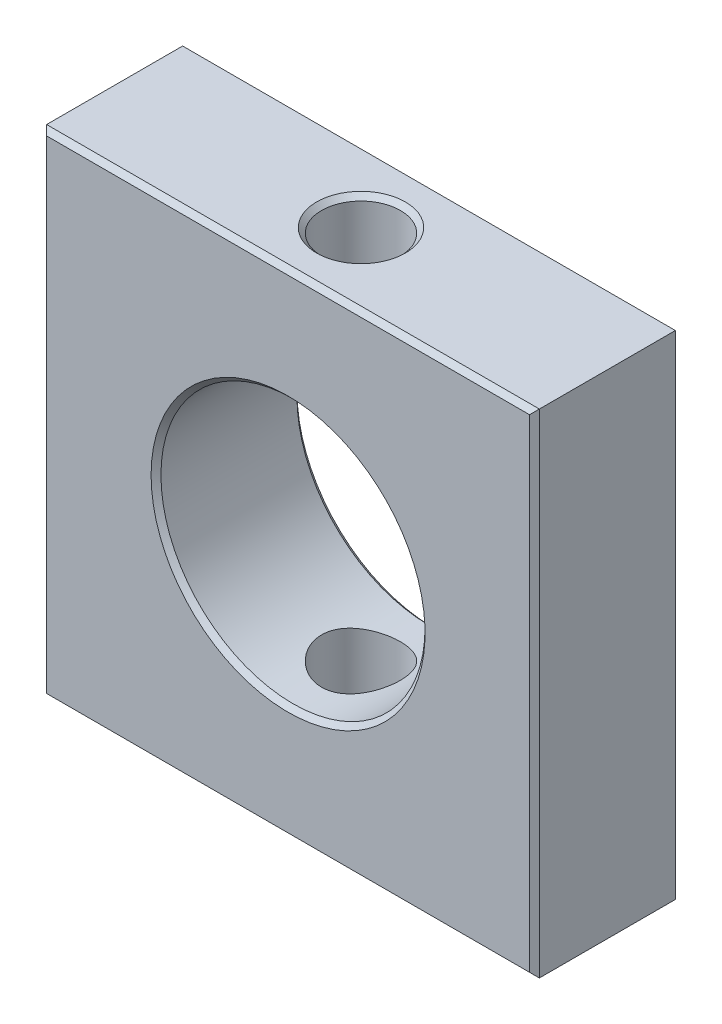
ISO-10303-21;
HEADER;
FILE_DESCRIPTION(('STEP AP214'),'2;1');
FILE_NAME('part.step','',(''),(''),'','','');
FILE_SCHEMA(('AUTOMOTIVE_DESIGN { 1 0 10303 214 1 1 1 1 }'));
ENDSEC;
DATA;
#1=APPLICATION_CONTEXT('core data for automotive mechanical design processes');
#2=APPLICATION_PROTOCOL_DEFINITION('international standard','automotive_design',2000,#1);
#3=PRODUCT_CONTEXT('',#1,'mechanical');
#4=PRODUCT('Part','Part','',(#3));
#5=PRODUCT_RELATED_PRODUCT_CATEGORY('part','',(#4));
#6=PRODUCT_DEFINITION_FORMATION('','',#4);
#7=PRODUCT_DEFINITION_CONTEXT('part definition',#1,'design');
#8=PRODUCT_DEFINITION('design','',#6,#7);
#9=PRODUCT_DEFINITION_SHAPE('','',#8);
#10=(LENGTH_UNIT() NAMED_UNIT(*) SI_UNIT(.MILLI.,.METRE.));
#11=(NAMED_UNIT(*) PLANE_ANGLE_UNIT() SI_UNIT($,.RADIAN.));
#12=(NAMED_UNIT(*) SI_UNIT($,.STERADIAN.) SOLID_ANGLE_UNIT());
#13=UNCERTAINTY_MEASURE_WITH_UNIT(LENGTH_MEASURE(1.E-05),#10,'distance_accuracy_value','');
#14=(GEOMETRIC_REPRESENTATION_CONTEXT(3) GLOBAL_UNCERTAINTY_ASSIGNED_CONTEXT((#13)) GLOBAL_UNIT_ASSIGNED_CONTEXT((#10,
#11,#12)) REPRESENTATION_CONTEXT('',''));
#15=CARTESIAN_POINT('',(0.,0.,0.));
#16=DIRECTION('',(0.,0.,1.));
#17=DIRECTION('',(1.,0.,0.));
#18=AXIS2_PLACEMENT_3D('',#15,#16,#17);
#19=CARTESIAN_POINT('',(0.,0.,7.4));
#20=DIRECTION('',(0.,0.,-1.));
#21=DIRECTION('',(-1.,0.,0.));
#22=AXIS2_PLACEMENT_3D('',#19,#20,#21);
#23=PLANE('',#22);
#24=CARTESIAN_POINT('',(0.,0.,7.4));
#25=DIRECTION('',(0.,0.,-1.));
#26=DIRECTION('',(-1.,0.,0.));
#27=AXIS2_PLACEMENT_3D('',#24,#25,#26);
#28=CIRCLE('',#27,6.94999999999999);
#29=CARTESIAN_POINT('',(-6.94999999999999,0.,7.4));
#30=VERTEX_POINT('',#29);
#31=EDGE_CURVE('E199',#30,#30,#28,.T.);
#32=ORIENTED_EDGE('',*,*,#31,.T.);
#33=EDGE_LOOP('',(#32));
#34=FACE_BOUND('',#33,.T.);
#35=DIRECTION('',(0.,-1.,0.));
#36=VECTOR('',#35,1.);
#37=CARTESIAN_POINT('',(-12.25,0.,7.4));
#38=LINE('',#37,#36);
#39=CARTESIAN_POINT('',(-12.25,12.25,7.4));
#40=VERTEX_POINT('',#39);
#41=CARTESIAN_POINT('',(-12.25,-12.25,7.4));
#42=VERTEX_POINT('',#41);
#43=EDGE_CURVE('E60',#40,#42,#38,.T.);
#44=ORIENTED_EDGE('',*,*,#43,.T.);
#45=DIRECTION('',(1.,0.,0.));
#46=VECTOR('',#45,1.);
#47=CARTESIAN_POINT('',(0.,-12.25,7.4));
#48=LINE('',#47,#46);
#49=CARTESIAN_POINT('',(12.25,-12.25,7.4));
#50=VERTEX_POINT('',#49);
#51=EDGE_CURVE('E196',#42,#50,#48,.T.);
#52=ORIENTED_EDGE('',*,*,#51,.T.);
#53=DIRECTION('',(0.,1.,0.));
#54=VECTOR('',#53,1.);
#55=CARTESIAN_POINT('',(12.25,0.,7.4));
#56=LINE('',#55,#54);
#57=CARTESIAN_POINT('',(12.25,12.25,7.4));
#58=VERTEX_POINT('',#57);
#59=EDGE_CURVE('E189',#50,#58,#56,.T.);
#60=ORIENTED_EDGE('',*,*,#59,.T.);
#61=DIRECTION('',(-1.,0.,0.));
#62=VECTOR('',#61,1.);
#63=CARTESIAN_POINT('',(0.,12.25,7.4));
#64=LINE('',#63,#62);
#65=EDGE_CURVE('E65',#58,#40,#64,.T.);
#66=ORIENTED_EDGE('',*,*,#65,.T.);
#67=EDGE_LOOP('',(#44,#52,#60,#66));
#68=FACE_BOUND('',#67,.T.);
#69=ADVANCED_FACE('F41',(#34,#68),#23,.F.);
#70=CARTESIAN_POINT('',(0.,0.,0.));
#71=DIRECTION('',(0.,0.,-1.));
#72=DIRECTION('',(-1.,0.,0.));
#73=AXIS2_PLACEMENT_3D('',#70,#71,#72);
#74=PLANE('',#73);
#75=CARTESIAN_POINT('',(0.,0.,0.));
#76=DIRECTION('',(0.,0.,-1.));
#77=DIRECTION('',(-1.,0.,0.));
#78=AXIS2_PLACEMENT_3D('',#75,#76,#77);
#79=CIRCLE('',#78,6.95);
#80=CARTESIAN_POINT('',(-6.95,0.,0.));
#81=VERTEX_POINT('',#80);
#82=EDGE_CURVE('E140',#81,#81,#79,.F.);
#83=ORIENTED_EDGE('',*,*,#82,.T.);
#84=EDGE_LOOP('',(#83));
#85=FACE_BOUND('',#84,.T.);
#86=DIRECTION('',(0.,1.,0.));
#87=VECTOR('',#86,1.);
#88=CARTESIAN_POINT('',(-12.25,12.5,0.));
#89=LINE('',#88,#87);
#90=CARTESIAN_POINT('',(-12.25,-12.25,0.));
#91=VERTEX_POINT('',#90);
#92=CARTESIAN_POINT('',(-12.25,12.25,0.));
#93=VERTEX_POINT('',#92);
#94=EDGE_CURVE('E138',#91,#93,#89,.T.);
#95=ORIENTED_EDGE('',*,*,#94,.T.);
#96=DIRECTION('',(1.,0.,0.));
#97=VECTOR('',#96,1.);
#98=CARTESIAN_POINT('',(12.5,12.25,0.));
#99=LINE('',#98,#97);
#100=CARTESIAN_POINT('',(12.25,12.25,0.));
#101=VERTEX_POINT('',#100);
#102=EDGE_CURVE('E115',#93,#101,#99,.T.);
#103=ORIENTED_EDGE('',*,*,#102,.T.);
#104=DIRECTION('',(0.,-1.,0.));
#105=VECTOR('',#104,1.);
#106=CARTESIAN_POINT('',(12.25,-12.5,0.));
#107=LINE('',#106,#105);
#108=CARTESIAN_POINT('',(12.25,-12.25,0.));
#109=VERTEX_POINT('',#108);
#110=EDGE_CURVE('E126',#101,#109,#107,.T.);
#111=ORIENTED_EDGE('',*,*,#110,.T.);
#112=DIRECTION('',(-1.,0.,0.));
#113=VECTOR('',#112,1.);
#114=CARTESIAN_POINT('',(-12.5,-12.25,0.));
#115=LINE('',#114,#113);
#116=EDGE_CURVE('E133',#109,#91,#115,.T.);
#117=ORIENTED_EDGE('',*,*,#116,.T.);
#118=EDGE_LOOP('',(#95,#103,#111,#117));
#119=FACE_BOUND('',#118,.T.);
#120=ADVANCED_FACE('F136',(#85,#119),#74,.T.);
#121=CARTESIAN_POINT('',(12.5,-12.5,7.4));
#122=DIRECTION('',(-1.,0.,0.));
#123=DIRECTION('',(0.,0.,1.));
#124=AXIS2_PLACEMENT_3D('',#121,#122,#123);
#125=PLANE('',#124);
#126=DIRECTION('',(0.,0.,-1.));
#127=VECTOR('',#126,1.);
#128=CARTESIAN_POINT('',(12.5,-12.5,7.4));
#129=LINE('',#128,#127);
#130=CARTESIAN_POINT('',(12.5,-12.5,7.15));
#131=VERTEX_POINT('',#130);
#132=CARTESIAN_POINT('',(12.5,-12.5,0.25));
#133=VERTEX_POINT('',#132);
#134=EDGE_CURVE('E380',#131,#133,#129,.T.);
#135=ORIENTED_EDGE('',*,*,#134,.T.);
#136=DIRECTION('',(0.,1.,0.));
#137=VECTOR('',#136,1.);
#138=CARTESIAN_POINT('',(12.5,12.5,0.25));
#139=LINE('',#138,#137);
#140=CARTESIAN_POINT('',(12.5,12.5,0.25));
#141=VERTEX_POINT('',#140);
#142=EDGE_CURVE('E186',#133,#141,#139,.T.);
#143=ORIENTED_EDGE('',*,*,#142,.T.);
#144=DIRECTION('',(0.,0.,-1.));
#145=VECTOR('',#144,1.);
#146=CARTESIAN_POINT('',(12.5,12.5,7.4));
#147=LINE('',#146,#145);
#148=CARTESIAN_POINT('',(12.5,12.5,7.15));
#149=VERTEX_POINT('',#148);
#150=EDGE_CURVE('E134',#149,#141,#147,.T.);
#151=ORIENTED_EDGE('',*,*,#150,.F.);
#152=DIRECTION('',(0.,-1.,0.));
#153=VECTOR('',#152,1.);
#154=CARTESIAN_POINT('',(12.5,-12.5,7.15));
#155=LINE('',#154,#153);
#156=EDGE_CURVE('E183',#149,#131,#155,.T.);
#157=ORIENTED_EDGE('',*,*,#156,.T.);
#158=EDGE_LOOP('',(#135,#143,#151,#157));
#159=FACE_BOUND('',#158,.T.);
#160=ADVANCED_FACE('F243',(#159),#125,.F.);
#161=CARTESIAN_POINT('',(-12.5,12.5,7.4));
#162=DIRECTION('',(0.,-1.,0.));
#163=DIRECTION('',(0.,0.,-1.));
#164=AXIS2_PLACEMENT_3D('',#161,#162,#163);
#165=PLANE('',#164);
#166=CARTESIAN_POINT('',(0.,12.5,3.7));
#167=DIRECTION('',(0.,-1.,0.));
#168=DIRECTION('',(0.,0.,-1.));
#169=AXIS2_PLACEMENT_3D('',#166,#167,#168);
#170=CIRCLE('',#169,2.25);
#171=CARTESIAN_POINT('',(0.,12.5,1.45));
#172=VERTEX_POINT('',#171);
#173=EDGE_CURVE('E157',#172,#172,#170,.T.);
#174=ORIENTED_EDGE('',*,*,#173,.T.);
#175=EDGE_LOOP('',(#174));
#176=FACE_BOUND('',#175,.T.);
#177=ORIENTED_EDGE('',*,*,#150,.T.);
#178=DIRECTION('',(-1.,0.,0.));
#179=VECTOR('',#178,1.);
#180=CARTESIAN_POINT('',(-12.5,12.5,0.25));
#181=LINE('',#180,#179);
#182=CARTESIAN_POINT('',(-12.5,12.5,0.25));
#183=VERTEX_POINT('',#182);
#184=EDGE_CURVE('E118',#141,#183,#181,.T.);
#185=ORIENTED_EDGE('',*,*,#184,.T.);
#186=DIRECTION('',(0.,0.,-1.));
#187=VECTOR('',#186,1.);
#188=CARTESIAN_POINT('',(-12.5,12.5,7.4));
#189=LINE('',#188,#187);
#190=CARTESIAN_POINT('',(-12.5,12.5,7.15));
#191=VERTEX_POINT('',#190);
#192=EDGE_CURVE('E240',#191,#183,#189,.T.);
#193=ORIENTED_EDGE('',*,*,#192,.F.);
#194=DIRECTION('',(1.,0.,0.));
#195=VECTOR('',#194,1.);
#196=CARTESIAN_POINT('',(-12.5,12.5,7.15));
#197=LINE('',#196,#195);
#198=EDGE_CURVE('E161',#191,#149,#197,.T.);
#199=ORIENTED_EDGE('',*,*,#198,.T.);
#200=EDGE_LOOP('',(#177,#185,#193,#199));
#201=FACE_BOUND('',#200,.T.);
#202=ADVANCED_FACE('F238',(#176,#201),#165,.F.);
#203=CARTESIAN_POINT('',(-12.5,-12.5,7.4));
#204=DIRECTION('',(1.,0.,0.));
#205=DIRECTION('',(0.,0.,-1.));
#206=AXIS2_PLACEMENT_3D('',#203,#204,#205);
#207=PLANE('',#206);
#208=ORIENTED_EDGE('',*,*,#192,.T.);
#209=DIRECTION('',(0.,-1.,0.));
#210=VECTOR('',#209,1.);
#211=CARTESIAN_POINT('',(-12.5,-12.5,0.25));
#212=LINE('',#211,#210);
#213=CARTESIAN_POINT('',(-12.5,-12.5,0.25));
#214=VERTEX_POINT('',#213);
#215=EDGE_CURVE('E169',#183,#214,#212,.T.);
#216=ORIENTED_EDGE('',*,*,#215,.T.);
#217=DIRECTION('',(0.,0.,-1.));
#218=VECTOR('',#217,1.);
#219=CARTESIAN_POINT('',(-12.5,-12.5,7.4));
#220=LINE('',#219,#218);
#221=CARTESIAN_POINT('',(-12.5,-12.5,7.15));
#222=VERTEX_POINT('',#221);
#223=EDGE_CURVE('E248',#222,#214,#220,.T.);
#224=ORIENTED_EDGE('',*,*,#223,.F.);
#225=DIRECTION('',(0.,1.,0.));
#226=VECTOR('',#225,1.);
#227=CARTESIAN_POINT('',(-12.5,-12.5,7.15));
#228=LINE('',#227,#226);
#229=EDGE_CURVE('E166',#222,#191,#228,.T.);
#230=ORIENTED_EDGE('',*,*,#229,.T.);
#231=EDGE_LOOP('',(#208,#216,#224,#230));
#232=FACE_BOUND('',#231,.T.);
#233=ADVANCED_FACE('F292',(#232),#207,.F.);
#234=CARTESIAN_POINT('',(-12.5,-12.5,7.4));
#235=DIRECTION('',(0.,1.,0.));
#236=DIRECTION('',(0.,0.,1.));
#237=AXIS2_PLACEMENT_3D('',#234,#235,#236);
#238=PLANE('',#237);
#239=CARTESIAN_POINT('',(0.,-12.5,3.7));
#240=DIRECTION('',(0.,1.,0.));
#241=DIRECTION('',(0.,0.,1.));
#242=AXIS2_PLACEMENT_3D('',#239,#240,#241);
#243=CIRCLE('',#242,2.25);
#244=CARTESIAN_POINT('',(0.,-12.5,5.94999999999999));
#245=VERTEX_POINT('',#244);
#246=EDGE_CURVE('E172',#245,#245,#243,.T.);
#247=ORIENTED_EDGE('',*,*,#246,.T.);
#248=EDGE_LOOP('',(#247));
#249=FACE_BOUND('',#248,.T.);
#250=ORIENTED_EDGE('',*,*,#223,.T.);
#251=DIRECTION('',(1.,0.,0.));
#252=VECTOR('',#251,1.);
#253=CARTESIAN_POINT('',(12.5,-12.5,0.25));
#254=LINE('',#253,#252);
#255=EDGE_CURVE('E180',#214,#133,#254,.T.);
#256=ORIENTED_EDGE('',*,*,#255,.T.);
#257=ORIENTED_EDGE('',*,*,#134,.F.);
#258=DIRECTION('',(-1.,0.,0.));
#259=VECTOR('',#258,1.);
#260=CARTESIAN_POINT('',(-12.5,-12.5,7.15));
#261=LINE('',#260,#259);
#262=EDGE_CURVE('E176',#131,#222,#261,.T.);
#263=ORIENTED_EDGE('',*,*,#262,.T.);
#264=EDGE_LOOP('',(#250,#256,#257,#263));
#265=FACE_BOUND('',#264,.T.);
#266=ADVANCED_FACE('F279',(#249,#265),#238,.F.);
#267=CARTESIAN_POINT('',(0.,0.,7.4));
#268=DIRECTION('',(0.,0.,-1.));
#269=DIRECTION('',(-1.,0.,0.));
#270=AXIS2_PLACEMENT_3D('',#267,#268,#269);
#271=CYLINDRICAL_SURFACE('',#270,6.7);
#272=CARTESIAN_POINT('',(0.,0.,0.250000000000002));
#273=DIRECTION('',(0.,0.,-1.));
#274=DIRECTION('',(-1.,0.,0.));
#275=AXIS2_PLACEMENT_3D('',#272,#273,#274);
#276=CIRCLE('',#275,6.7);
#277=CARTESIAN_POINT('',(-6.7,0.,0.250000000000002));
#278=VERTEX_POINT('',#277);
#279=EDGE_CURVE('E153',#278,#278,#276,.T.);
#280=ORIENTED_EDGE('',*,*,#279,.T.);
#281=EDGE_LOOP('',(#280));
#282=FACE_BOUND('',#281,.T.);
#283=CARTESIAN_POINT('',(0.,0.,7.15));
#284=DIRECTION('',(0.,0.,-1.));
#285=DIRECTION('',(-1.,0.,0.));
#286=AXIS2_PLACEMENT_3D('',#283,#284,#285);
#287=CIRCLE('',#286,6.7);
#288=CARTESIAN_POINT('',(-6.7,0.,7.15));
#289=VERTEX_POINT('',#288);
#290=EDGE_CURVE('E145',#289,#289,#287,.F.);
#291=ORIENTED_EDGE('',*,*,#290,.T.);
#292=EDGE_LOOP('',(#291));
#293=FACE_BOUND('',#292,.T.);
#294=CARTESIAN_POINT('',(0.,-6.7,5.7));
#295=CARTESIAN_POINT('',(0.109743361358821,-6.69999901435449,5.69999860184998));
#296=CARTESIAN_POINT('',(0.219500873974359,-6.69727785917086,5.69093733235752));
#297=CARTESIAN_POINT('',(0.435821268100605,-6.68668840274671,5.65501665808003));
#298=CARTESIAN_POINT('',(0.542383159189071,-6.67881852265205,5.62815179379803));
#299=CARTESIAN_POINT('',(0.749160848463717,-6.65879423500564,5.55759966332937));
#300=CARTESIAN_POINT('',(0.849385705061714,-6.64664611410368,5.51393707186632));
#301=CARTESIAN_POINT('',(1.04109165908827,-6.61932898536908,5.41112964199115));
#302=CARTESIAN_POINT('',(1.13257161705671,-6.60415958465563,5.35198278972377));
#303=CARTESIAN_POINT('',(1.30679399162978,-6.57193622855964,5.21811234060998));
#304=CARTESIAN_POINT('',(1.38925243957815,-6.55484394233304,5.14302842818817));
#305=CARTESIAN_POINT('',(1.54061411732459,-6.52093067960535,4.98018327120106));
#306=CARTESIAN_POINT('',(1.60951509351046,-6.50410974863661,4.89241992317427));
#307=CARTESIAN_POINT('',(1.73329508752743,-6.47223883737101,4.70431083280065));
#308=CARTESIAN_POINT('',(1.78782844079823,-6.45723652410896,4.60372880113103));
#309=CARTESIAN_POINT('',(1.87909105818033,-6.43127391741259,4.39430167159646));
#310=CARTESIAN_POINT('',(1.91582454975421,-6.42031266437555,4.28545854284966));
#311=CARTESIAN_POINT('',(1.96942250711186,-6.40407252509908,4.06578563291481));
#312=CARTESIAN_POINT('',(1.98681009654374,-6.39864438114924,3.95509481772434));
#313=CARTESIAN_POINT('',(2.00285608148857,-6.393640941842,3.73224433880319));
#314=CARTESIAN_POINT('',(2.00151896423086,-6.39406424423099,3.62008503342111));
#315=CARTESIAN_POINT('',(1.98056458959883,-6.40058352381707,3.40172718064994));
#316=CARTESIAN_POINT('',(1.96160163408821,-6.40647644804714,3.29545877974806));
#317=CARTESIAN_POINT('',(1.90699057622309,-6.42294264775203,3.08768611210035));
#318=CARTESIAN_POINT('',(1.87134084195745,-6.43351638098884,2.98618231238508));
#319=CARTESIAN_POINT('',(1.78388388495136,-6.45831561688666,2.78921484781267));
#320=CARTESIAN_POINT('',(1.73186365844019,-6.47258879593137,2.69385201932576));
#321=CARTESIAN_POINT('',(1.61329044901396,-6.50315565265741,2.51298952762155));
#322=CARTESIAN_POINT('',(1.54673397423003,-6.51944981540837,2.42749224184044));
#323=CARTESIAN_POINT('',(1.39772347841685,-6.55304722393875,2.26507539922493));
#324=CARTESIAN_POINT('',(1.31472616230933,-6.57036434391284,2.18865631222923));
#325=CARTESIAN_POINT('',(1.13687871372721,-6.60345945676516,2.0507055351464));
#326=CARTESIAN_POINT('',(1.04202785044614,-6.61923735463889,1.98917476365559));
#327=CARTESIAN_POINT('',(0.842262554658351,-6.64761795940622,1.88244739970788));
#328=CARTESIAN_POINT('',(0.73728605348341,-6.66019910688464,1.83736086675264));
#329=CARTESIAN_POINT('',(0.520777756762124,-6.68061329202322,1.76563038239234));
#330=CARTESIAN_POINT('',(0.40924778001447,-6.68844764030789,1.73898133997835));
#331=CARTESIAN_POINT('',(0.187053836849448,-6.69827863557586,1.70571326617071));
#332=CARTESIAN_POINT('',(0.0765000326649953,-6.70047290955619,1.69841585461959));
#333=CARTESIAN_POINT('',(-0.144259260354484,-6.69935577174841,1.70215810056413));
#334=CARTESIAN_POINT('',(-0.254464793255684,-6.69604508692854,1.7131953368414));
#335=CARTESIAN_POINT('',(-0.468845320229736,-6.68441932098258,1.75274463654809));
#336=CARTESIAN_POINT('',(-0.573100014213629,-6.67621759074487,1.78086115128937));
#337=CARTESIAN_POINT('',(-0.775390199297328,-6.65575803734013,1.85329576315047));
#338=CARTESIAN_POINT('',(-0.873424943904828,-6.64349972841274,1.89761580064912));
#339=CARTESIAN_POINT('',(-1.06299504601103,-6.6158472668663,2.00234366564223));
#340=CARTESIAN_POINT('',(-1.15432925198953,-6.6003875200001,2.06309781840749));
#341=CARTESIAN_POINT('',(-1.32573767112902,-6.56810776474197,2.19854782625144));
#342=CARTESIAN_POINT('',(-1.40580908065082,-6.55128741929277,2.27324714195717));
#343=CARTESIAN_POINT('',(-1.55540014036077,-6.51742513941161,2.43765354745442));
#344=CARTESIAN_POINT('',(-1.62443729290816,-6.50039695797792,2.5278034344722));
#345=CARTESIAN_POINT('',(-1.74643651734004,-6.46868973914826,2.71877840931161));
#346=CARTESIAN_POINT('',(-1.79939902761497,-6.45401063769292,2.81960320590408));
#347=CARTESIAN_POINT('',(-1.88738025081556,-6.42883293312705,3.02873352788058));
#348=CARTESIAN_POINT('',(-1.9224839672241,-6.41831458016538,3.13700077744645));
#349=CARTESIAN_POINT('',(-1.97385869716872,-6.40270385956844,3.35828167105228));
#350=CARTESIAN_POINT('',(-1.99013608322307,-6.39760965596106,3.47129369560412));
#351=CARTESIAN_POINT('',(-2.0029658351958,-6.3936036354854,3.69384728759221));
#352=CARTESIAN_POINT('',(-2.00030418711452,-6.3944454551483,3.80333970611141));
#353=CARTESIAN_POINT('',(-1.97720508955258,-6.40162503364949,4.02024022034185));
#354=CARTESIAN_POINT('',(-1.95676833875767,-6.40796257646741,4.1276483978087));
#355=CARTESIAN_POINT('',(-1.89920426613909,-6.42525509132359,4.33606062800298));
#356=CARTESIAN_POINT('',(-1.86228309951481,-6.4361529294676,4.43712671172225));
#357=CARTESIAN_POINT('',(-1.77295860632938,-6.46132813255444,4.63171053082962));
#358=CARTESIAN_POINT('',(-1.7205523393202,-6.47560613925115,4.72522682829942));
#359=CARTESIAN_POINT('',(-1.59952912057487,-6.50657638983081,4.90570883384898));
#360=CARTESIAN_POINT('',(-1.53039517029805,-6.52333719036361,4.99231609879284));
#361=CARTESIAN_POINT('',(-1.37881207245741,-6.55704939466007,5.15295496626138));
#362=CARTESIAN_POINT('',(-1.29635948205938,-6.5740008466497,5.22698330698632));
#363=CARTESIAN_POINT('',(-1.11761480582216,-6.60677053085957,5.36248971014035));
#364=CARTESIAN_POINT('',(-1.02099212501924,-6.62254197161737,5.42354416925239));
#365=CARTESIAN_POINT('',(-0.81838237942453,-6.65061520610284,5.52845547097434));
#366=CARTESIAN_POINT('',(-0.712399803993862,-6.66291865147025,5.57232050398056));
#367=CARTESIAN_POINT('',(-0.506100419135844,-6.68157083352248,5.6375894330366));
#368=CARTESIAN_POINT('',(-0.406438821554194,-6.68842498929753,5.66093041929964));
#369=CARTESIAN_POINT('',(-0.20452196133352,-6.6976396648136,5.69213509027727));
#370=CARTESIAN_POINT('',(-0.102267125082487,-6.70000091849868,5.70000130290144));
#371=CARTESIAN_POINT('',(0.,-6.7,5.7));
#372=B_SPLINE_CURVE_WITH_KNOTS('',3,(#294,#295,#296,#297,#298,#299,#300,#301,#302,#303,#304,
#305,#306,#307,#308,#309,#310,#311,#312,#313,#314,#315,#316,#317,#318,#319,#320,#321,#322,#323,
#324,#325,#326,#327,#328,#329,#330,#331,#332,#333,#334,#335,#336,#337,#338,#339,#340,#341,#342,
#343,#344,#345,#346,#347,#348,#349,#350,#351,#352,#353,#354,#355,#356,#357,#358,#359,#360,#361,
#362,#363,#364,#365,#366,#367,#368,#369,#370,#371),.UNSPECIFIED.,.T.,.F.,(4,2,2,2,2,2,2,2,2,2,2,
2,2,2,2,2,2,2,2,2,2,2,2,2,2,2,2,2,2,2,2,2,2,2,2,2,2,2,4),(0.,0.32885446291896,0.657809816205378,
0.986283790076346,1.31480050592643,1.65173545532978,1.98872636505149,2.33320675681966,
2.67760529443513,3.01244589828376,3.3472062615768,3.67001573967276,3.99285679405367,
4.32008541956658,4.64739273792106,4.98822575334411,5.32907979251338,5.67217499194088,
6.01517541715933,6.34598232115241,6.6767455432545,7.00012590953024,7.32354501343517,
7.65439703412549,7.98533126834956,8.32815604163266,8.67097146449875,9.01213953466786,
9.35319208914254,9.68017574503415,10.0071465487638,10.3301380400965,10.6531909033726,
10.9879082937643,11.322712346613,11.6671737515337,12.0114708277658,12.3179722441952,
12.6244235873731),.UNSPECIFIED.);
#373=CARTESIAN_POINT('',(0.,-6.7,5.7));
#374=VERTEX_POINT('',#373);
#375=EDGE_CURVE('E260',#374,#374,#372,.T.);
#376=ORIENTED_EDGE('',*,*,#375,.F.);
#377=EDGE_LOOP('',(#376));
#378=FACE_BOUND('',#377,.T.);
#379=CARTESIAN_POINT('',(0.,6.7,5.7));
#380=CARTESIAN_POINT('',(-0.109743361358818,6.69999901435449,5.69999860184998));
#381=CARTESIAN_POINT('',(-0.219500873974355,6.69727785917086,5.69093733235752));
#382=CARTESIAN_POINT('',(-0.435821268100602,6.68668840274672,5.65501665808003));
#383=CARTESIAN_POINT('',(-0.542383159189068,6.67881852265206,5.62815179379803));
#384=CARTESIAN_POINT('',(-0.749160848463714,6.65879423500564,5.55759966332937));
#385=CARTESIAN_POINT('',(-0.84938570506171,6.64664611410368,5.51393707186632));
#386=CARTESIAN_POINT('',(-1.04109165908826,6.61932898536908,5.41112964199115));
#387=CARTESIAN_POINT('',(-1.1325716170567,6.60415958465563,5.35198278972377));
#388=CARTESIAN_POINT('',(-1.30679399162978,6.57193622855964,5.21811234060998));
#389=CARTESIAN_POINT('',(-1.38925243957814,6.55484394233304,5.14302842818817));
#390=CARTESIAN_POINT('',(-1.54061411732458,6.52093067960535,4.98018327120106));
#391=CARTESIAN_POINT('',(-1.60951509351046,6.50410974863661,4.89241992317427));
#392=CARTESIAN_POINT('',(-1.73329508752743,6.47223883737101,4.70431083280065));
#393=CARTESIAN_POINT('',(-1.78782844079822,6.45723652410896,4.60372880113102));
#394=CARTESIAN_POINT('',(-1.87909105818032,6.43127391741259,4.39430167159646));
#395=CARTESIAN_POINT('',(-1.91582454975421,6.42031266437556,4.28545854284966));
#396=CARTESIAN_POINT('',(-1.96942250711185,6.40407252509909,4.0657856329148));
#397=CARTESIAN_POINT('',(-1.98681009654373,6.39864438114925,3.95509481772434));
#398=CARTESIAN_POINT('',(-2.00285608148856,6.393640941842,3.73224433880319));
#399=CARTESIAN_POINT('',(-2.00151896423086,6.39406424423099,3.62008503342111));
#400=CARTESIAN_POINT('',(-1.98056458959882,6.40058352381708,3.40172718064994));
#401=CARTESIAN_POINT('',(-1.9616016340882,6.40647644804714,3.29545877974806));
#402=CARTESIAN_POINT('',(-1.90699057622308,6.42294264775203,3.08768611210035));
#403=CARTESIAN_POINT('',(-1.87134084195745,6.43351638098884,2.98618231238508));
#404=CARTESIAN_POINT('',(-1.78388388495136,6.45831561688666,2.78921484781267));
#405=CARTESIAN_POINT('',(-1.73186365844019,6.47258879593137,2.69385201932576));
#406=CARTESIAN_POINT('',(-1.61329044901396,6.50315565265741,2.51298952762155));
#407=CARTESIAN_POINT('',(-1.54673397423002,6.51944981540838,2.42749224184044));
#408=CARTESIAN_POINT('',(-1.39772347841684,6.55304722393875,2.26507539922493));
#409=CARTESIAN_POINT('',(-1.31472616230933,6.57036434391284,2.18865631222923));
#410=CARTESIAN_POINT('',(-1.13687871372721,6.60345945676517,2.0507055351464));
#411=CARTESIAN_POINT('',(-1.04202785044614,6.61923735463889,1.98917476365559));
#412=CARTESIAN_POINT('',(-0.842262554658348,6.64761795940622,1.88244739970788));
#413=CARTESIAN_POINT('',(-0.737286053483406,6.66019910688464,1.83736086675264));
#414=CARTESIAN_POINT('',(-0.52077775676212,6.68061329202322,1.76563038239234));
#415=CARTESIAN_POINT('',(-0.409247780014466,6.68844764030789,1.73898133997835));
#416=CARTESIAN_POINT('',(-0.187053836849444,6.69827863557586,1.70571326617071));
#417=CARTESIAN_POINT('',(-0.0765000326649912,6.70047290955619,1.69841585461959));
#418=CARTESIAN_POINT('',(0.144259260354488,6.69935577174841,1.70215810056413));
#419=CARTESIAN_POINT('',(0.254464793255688,6.69604508692854,1.7131953368414));
#420=CARTESIAN_POINT('',(0.46884532022974,6.68441932098258,1.75274463654809));
#421=CARTESIAN_POINT('',(0.573100014213633,6.67621759074487,1.78086115128937));
#422=CARTESIAN_POINT('',(0.775390199297332,6.65575803734013,1.85329576315047));
#423=CARTESIAN_POINT('',(0.873424943904832,6.64349972841274,1.89761580064912));
#424=CARTESIAN_POINT('',(1.06299504601103,6.6158472668663,2.00234366564223));
#425=CARTESIAN_POINT('',(1.15432925198954,6.6003875200001,2.06309781840749));
#426=CARTESIAN_POINT('',(1.32573767112903,6.56810776474197,2.19854782625144));
#427=CARTESIAN_POINT('',(1.40580908065083,6.55128741929277,2.27324714195717));
#428=CARTESIAN_POINT('',(1.55540014036078,6.51742513941161,2.43765354745442));
#429=CARTESIAN_POINT('',(1.62443729290817,6.50039695797792,2.5278034344722));
#430=CARTESIAN_POINT('',(1.74643651734005,6.46868973914826,2.71877840931161));
#431=CARTESIAN_POINT('',(1.79939902761497,6.45401063769292,2.81960320590408));
#432=CARTESIAN_POINT('',(1.88738025081556,6.42883293312705,3.02873352788058));
#433=CARTESIAN_POINT('',(1.9224839672241,6.41831458016538,3.13700077744645));
#434=CARTESIAN_POINT('',(1.97385869716872,6.40270385956844,3.35828167105228));
#435=CARTESIAN_POINT('',(1.99013608322308,6.39760965596106,3.47129369560412));
#436=CARTESIAN_POINT('',(2.0029658351958,6.39360363548539,3.69384728759221));
#437=CARTESIAN_POINT('',(2.00030418711452,6.3944454551483,3.80333970611141));
#438=CARTESIAN_POINT('',(1.97720508955258,6.40162503364949,4.02024022034185));
#439=CARTESIAN_POINT('',(1.95676833875768,6.40796257646741,4.1276483978087));
#440=CARTESIAN_POINT('',(1.89920426613909,6.42525509132359,4.33606062800298));
#441=CARTESIAN_POINT('',(1.86228309951482,6.4361529294676,4.43712671172225));
#442=CARTESIAN_POINT('',(1.77295860632938,6.46132813255444,4.63171053082962));
#443=CARTESIAN_POINT('',(1.7205523393202,6.47560613925115,4.72522682829942));
#444=CARTESIAN_POINT('',(1.59952912057487,6.50657638983081,4.90570883384898));
#445=CARTESIAN_POINT('',(1.53039517029805,6.5233371903636,4.99231609879284));
#446=CARTESIAN_POINT('',(1.37881207245741,6.55704939466007,5.15295496626138));
#447=CARTESIAN_POINT('',(1.29635948205938,6.5740008466497,5.22698330698632));
#448=CARTESIAN_POINT('',(1.11761480582217,6.60677053085957,5.36248971014035));
#449=CARTESIAN_POINT('',(1.02099212501924,6.62254197161737,5.42354416925239));
#450=CARTESIAN_POINT('',(0.818382379424535,6.65061520610284,5.52845547097434));
#451=CARTESIAN_POINT('',(0.712399803993866,6.66291865147025,5.57232050398056));
#452=CARTESIAN_POINT('',(0.506100419135847,6.68157083352248,5.6375894330366));
#453=CARTESIAN_POINT('',(0.406438821554197,6.68842498929753,5.66093041929964));
#454=CARTESIAN_POINT('',(0.204521961333524,6.6976396648136,5.69213509027727));
#455=CARTESIAN_POINT('',(0.10226712508249,6.70000091849868,5.70000130290144));
#456=CARTESIAN_POINT('',(0.,6.7,5.7));
#457=B_SPLINE_CURVE_WITH_KNOTS('',3,(#379,#380,#381,#382,#383,#384,#385,#386,#387,#388,#389,
#390,#391,#392,#393,#394,#395,#396,#397,#398,#399,#400,#401,#402,#403,#404,#405,#406,#407,#408,
#409,#410,#411,#412,#413,#414,#415,#416,#417,#418,#419,#420,#421,#422,#423,#424,#425,#426,#427,
#428,#429,#430,#431,#432,#433,#434,#435,#436,#437,#438,#439,#440,#441,#442,#443,#444,#445,#446,
#447,#448,#449,#450,#451,#452,#453,#454,#455,#456),.UNSPECIFIED.,.T.,.F.,(4,2,2,2,2,2,2,2,2,2,2,
2,2,2,2,2,2,2,2,2,2,2,2,2,2,2,2,2,2,2,2,2,2,2,2,2,2,2,4),(0.,0.32885446291896,0.657809816205378,
0.986283790076346,1.31480050592642,1.65173545532978,1.98872636505149,2.33320675681966,
2.67760529443513,3.01244589828376,3.3472062615768,3.67001573967276,3.99285679405367,
4.32008541956658,4.64739273792106,4.98822575334411,5.32907979251338,5.67217499194088,
6.01517541715933,6.34598232115241,6.6767455432545,7.00012590953024,7.32354501343517,
7.65439703412548,7.98533126834956,8.32815604163266,8.67097146449875,9.01213953466785,
9.35319208914254,9.68017574503415,10.0071465487638,10.3301380400965,10.6531909033726,
10.9879082937643,11.322712346613,11.6671737515337,12.0114708277658,12.3179722441952,
12.6244235873731),.UNSPECIFIED.);
#458=CARTESIAN_POINT('',(0.,6.7,5.7));
#459=VERTEX_POINT('',#458);
#460=EDGE_CURVE('E213',#459,#459,#457,.T.);
#461=ORIENTED_EDGE('',*,*,#460,.F.);
#462=EDGE_LOOP('',(#461));
#463=FACE_BOUND('',#462,.T.);
#464=ADVANCED_FACE('F264',(#282,#293,#378,#463),#271,.F.);
#465=CARTESIAN_POINT('',(0.,-12.5,3.7));
#466=DIRECTION('',(0.,1.,0.));
#467=DIRECTION('',(0.,0.,1.));
#468=AXIS2_PLACEMENT_3D('',#465,#466,#467);
#469=CYLINDRICAL_SURFACE('',#468,2.);
#470=CARTESIAN_POINT('',(0.,12.25,3.7));
#471=DIRECTION('',(0.,-1.,0.));
#472=DIRECTION('',(0.,0.,-1.));
#473=AXIS2_PLACEMENT_3D('',#470,#471,#472);
#474=CIRCLE('',#473,2.);
#475=CARTESIAN_POINT('',(0.,12.25,1.7));
#476=VERTEX_POINT('',#475);
#477=EDGE_CURVE('E11',#476,#476,#474,.F.);
#478=ORIENTED_EDGE('',*,*,#477,.T.);
#479=EDGE_LOOP('',(#478));
#480=FACE_BOUND('',#479,.T.);
#481=ORIENTED_EDGE('',*,*,#460,.T.);
#482=EDGE_LOOP('',(#481));
#483=FACE_BOUND('',#482,.T.);
#484=ADVANCED_FACE('F267',(#480,#483),#469,.F.);
#485=CARTESIAN_POINT('',(0.,-12.25,3.7));
#486=DIRECTION('',(0.,1.,0.));
#487=DIRECTION('',(0.,0.,1.));
#488=AXIS2_PLACEMENT_3D('',#485,#486,#487);
#489=CIRCLE('',#488,2.);
#490=CARTESIAN_POINT('',(0.,-12.25,5.7));
#491=VERTEX_POINT('',#490);
#492=EDGE_CURVE('E52',#491,#491,#489,.F.);
#493=ORIENTED_EDGE('',*,*,#492,.T.);
#494=EDGE_LOOP('',(#493));
#495=FACE_BOUND('',#494,.T.);
#496=ORIENTED_EDGE('',*,*,#375,.T.);
#497=EDGE_LOOP('',(#496));
#498=FACE_BOUND('',#497,.T.);
#499=ADVANCED_FACE('F270',(#495,#498),#469,.F.);
#500=CARTESIAN_POINT('',(0.,0.,0.));
#501=DIRECTION('',(0.,0.,-1.));
#502=DIRECTION('',(-1.,0.,0.));
#503=AXIS2_PLACEMENT_3D('',#500,#501,#502);
#504=CONICAL_SURFACE('',#503,6.95,0.785398163397447);
#505=ORIENTED_EDGE('',*,*,#279,.F.);
#506=EDGE_LOOP('',(#505));
#507=FACE_BOUND('',#506,.T.);
#508=ORIENTED_EDGE('',*,*,#82,.F.);
#509=EDGE_LOOP('',(#508));
#510=FACE_BOUND('',#509,.T.);
#511=ADVANCED_FACE('F277',(#507,#510),#504,.F.);
#512=CARTESIAN_POINT('',(-12.5,-12.5,0.25));
#513=DIRECTION('',(0.,-0.707106781186552,-0.707106781186543));
#514=DIRECTION('',(-1.,0.,0.));
#515=AXIS2_PLACEMENT_3D('',#512,#513,#514);
#516=PLANE('',#515);
#517=DIRECTION('',(0.577350269189623,0.577350269189623,-0.577350269189631));
#518=VECTOR('',#517,1.);
#519=CARTESIAN_POINT('',(-12.5,-12.5,0.25));
#520=LINE('',#519,#518);
#521=EDGE_CURVE('E122',#91,#214,#520,.F.);
#522=ORIENTED_EDGE('',*,*,#521,.F.);
#523=ORIENTED_EDGE('',*,*,#116,.F.);
#524=DIRECTION('',(-0.577350269189623,0.577350269189623,-0.577350269189631));
#525=VECTOR('',#524,1.);
#526=CARTESIAN_POINT('',(12.5,-12.5,0.25));
#527=LINE('',#526,#525);
#528=EDGE_CURVE('E129',#133,#109,#527,.T.);
#529=ORIENTED_EDGE('',*,*,#528,.F.);
#530=ORIENTED_EDGE('',*,*,#255,.F.);
#531=EDGE_LOOP('',(#522,#523,#529,#530));
#532=FACE_BOUND('',#531,.T.);
#533=ADVANCED_FACE('F308',(#532),#516,.T.);
#534=CARTESIAN_POINT('',(12.5,-12.5,0.25));
#535=DIRECTION('',(0.707106781186552,0.,-0.707106781186543));
#536=DIRECTION('',(0.,-1.,0.));
#537=AXIS2_PLACEMENT_3D('',#534,#535,#536);
#538=PLANE('',#537);
#539=ORIENTED_EDGE('',*,*,#528,.T.);
#540=ORIENTED_EDGE('',*,*,#110,.F.);
#541=DIRECTION('',(0.577350269189623,0.577350269189623,0.577350269189631));
#542=VECTOR('',#541,1.);
#543=CARTESIAN_POINT('',(4.16666666666675,4.16666666666675,-8.08333333333337));
#544=LINE('',#543,#542);
#545=EDGE_CURVE('E111',#141,#101,#544,.F.);
#546=ORIENTED_EDGE('',*,*,#545,.F.);
#547=ORIENTED_EDGE('',*,*,#142,.F.);
#548=EDGE_LOOP('',(#539,#540,#546,#547));
#549=FACE_BOUND('',#548,.T.);
#550=ADVANCED_FACE('F127',(#549),#538,.T.);
#551=CARTESIAN_POINT('',(-12.5,-12.5,0.25));
#552=DIRECTION('',(-0.707106781186552,0.,-0.707106781186543));
#553=DIRECTION('',(0.,1.,0.));
#554=AXIS2_PLACEMENT_3D('',#551,#552,#553);
#555=PLANE('',#554);
#556=ORIENTED_EDGE('',*,*,#521,.T.);
#557=ORIENTED_EDGE('',*,*,#215,.F.);
#558=DIRECTION('',(0.577350269189623,-0.577350269189623,-0.577350269189631));
#559=VECTOR('',#558,1.);
#560=CARTESIAN_POINT('',(-4.16666666666674,4.16666666666675,-8.08333333333337));
#561=LINE('',#560,#559);
#562=EDGE_CURVE('E123',#93,#183,#561,.F.);
#563=ORIENTED_EDGE('',*,*,#562,.F.);
#564=ORIENTED_EDGE('',*,*,#94,.F.);
#565=EDGE_LOOP('',(#556,#557,#563,#564));
#566=FACE_BOUND('',#565,.T.);
#567=ADVANCED_FACE('F318',(#566),#555,.T.);
#568=CARTESIAN_POINT('',(-12.5,12.5,0.25));
#569=DIRECTION('',(0.,0.707106781186552,-0.707106781186543));
#570=DIRECTION('',(1.,0.,0.));
#571=AXIS2_PLACEMENT_3D('',#568,#569,#570);
#572=PLANE('',#571);
#573=ORIENTED_EDGE('',*,*,#545,.T.);
#574=ORIENTED_EDGE('',*,*,#102,.F.);
#575=ORIENTED_EDGE('',*,*,#562,.T.);
#576=ORIENTED_EDGE('',*,*,#184,.F.);
#577=EDGE_LOOP('',(#573,#574,#575,#576));
#578=FACE_BOUND('',#577,.T.);
#579=ADVANCED_FACE('F113',(#578),#572,.T.);
#580=CARTESIAN_POINT('',(0.,0.,7.15));
#581=DIRECTION('',(0.,0.,1.));
#582=DIRECTION('',(1.,0.,0.));
#583=AXIS2_PLACEMENT_3D('',#580,#581,#582);
#584=CONICAL_SURFACE('',#583,6.7,0.785398163397443);
#585=ORIENTED_EDGE('',*,*,#31,.F.);
#586=EDGE_LOOP('',(#585));
#587=FACE_BOUND('',#586,.T.);
#588=ORIENTED_EDGE('',*,*,#290,.F.);
#589=EDGE_LOOP('',(#588));
#590=FACE_BOUND('',#589,.T.);
#591=ADVANCED_FACE('F317',(#587,#590),#584,.F.);
#592=CARTESIAN_POINT('',(0.,12.25,7.4));
#593=DIRECTION('',(0.,-0.707106781186547,-0.707106781186547));
#594=DIRECTION('',(-1.,0.,0.));
#595=AXIS2_PLACEMENT_3D('',#592,#593,#594);
#596=PLANE('',#595);
#597=DIRECTION('',(-0.577350269189626,-0.577350269189626,0.577350269189626));
#598=VECTOR('',#597,1.);
#599=CARTESIAN_POINT('',(8.16666666666667,8.16666666666667,11.4833333333333));
#600=LINE('',#599,#598);
#601=EDGE_CURVE('E219',#149,#58,#600,.T.);
#602=ORIENTED_EDGE('',*,*,#601,.F.);
#603=ORIENTED_EDGE('',*,*,#198,.F.);
#604=DIRECTION('',(0.577350269189626,-0.577350269189626,0.577350269189626));
#605=VECTOR('',#604,1.);
#606=CARTESIAN_POINT('',(-8.16666666666666,8.16666666666667,11.4833333333333));
#607=LINE('',#606,#605);
#608=EDGE_CURVE('E46',#40,#191,#607,.F.);
#609=ORIENTED_EDGE('',*,*,#608,.F.);
#610=ORIENTED_EDGE('',*,*,#65,.F.);
#611=EDGE_LOOP('',(#602,#603,#609,#610));
#612=FACE_BOUND('',#611,.T.);
#613=ADVANCED_FACE('F233',(#612),#596,.F.);
#614=CARTESIAN_POINT('',(-12.25,0.,7.4));
#615=DIRECTION('',(0.707106781186547,0.,-0.707106781186547));
#616=DIRECTION('',(0.,-1.,0.));
#617=AXIS2_PLACEMENT_3D('',#614,#615,#616);
#618=PLANE('',#617);
#619=ORIENTED_EDGE('',*,*,#608,.T.);
#620=ORIENTED_EDGE('',*,*,#229,.F.);
#621=DIRECTION('',(0.577350269189626,0.577350269189626,0.577350269189626));
#622=VECTOR('',#621,1.);
#623=CARTESIAN_POINT('',(-8.16666666666666,-8.16666666666667,11.4833333333333));
#624=LINE('',#623,#622);
#625=EDGE_CURVE('E217',#42,#222,#624,.F.);
#626=ORIENTED_EDGE('',*,*,#625,.F.);
#627=ORIENTED_EDGE('',*,*,#43,.F.);
#628=EDGE_LOOP('',(#619,#620,#626,#627));
#629=FACE_BOUND('',#628,.T.);
#630=ADVANCED_FACE('F230',(#629),#618,.F.);
#631=CARTESIAN_POINT('',(12.25,0.,7.4));
#632=DIRECTION('',(-0.707106781186547,0.,-0.707106781186547));
#633=DIRECTION('',(0.,1.,0.));
#634=AXIS2_PLACEMENT_3D('',#631,#632,#633);
#635=PLANE('',#634);
#636=ORIENTED_EDGE('',*,*,#601,.T.);
#637=ORIENTED_EDGE('',*,*,#59,.F.);
#638=DIRECTION('',(0.577350269189626,-0.577350269189626,-0.577350269189626));
#639=VECTOR('',#638,1.);
#640=CARTESIAN_POINT('',(8.16666666666667,-8.16666666666667,11.4833333333333));
#641=LINE('',#640,#639);
#642=EDGE_CURVE('E214',#131,#50,#641,.F.);
#643=ORIENTED_EDGE('',*,*,#642,.F.);
#644=ORIENTED_EDGE('',*,*,#156,.F.);
#645=EDGE_LOOP('',(#636,#637,#643,#644));
#646=FACE_BOUND('',#645,.T.);
#647=ADVANCED_FACE('F349',(#646),#635,.F.);
#648=CARTESIAN_POINT('',(0.,-12.25,7.4));
#649=DIRECTION('',(0.,0.707106781186547,-0.707106781186547));
#650=DIRECTION('',(1.,0.,0.));
#651=AXIS2_PLACEMENT_3D('',#648,#649,#650);
#652=PLANE('',#651);
#653=ORIENTED_EDGE('',*,*,#625,.T.);
#654=ORIENTED_EDGE('',*,*,#262,.F.);
#655=ORIENTED_EDGE('',*,*,#642,.T.);
#656=ORIENTED_EDGE('',*,*,#51,.F.);
#657=EDGE_LOOP('',(#653,#654,#655,#656));
#658=FACE_BOUND('',#657,.T.);
#659=ADVANCED_FACE('F341',(#658),#652,.F.);
#660=CARTESIAN_POINT('',(0.,-12.5,3.7));
#661=DIRECTION('',(0.,-1.,0.));
#662=DIRECTION('',(0.,0.,-1.));
#663=AXIS2_PLACEMENT_3D('',#660,#661,#662);
#664=CONICAL_SURFACE('',#663,2.25,0.785398163397455);
#665=ORIENTED_EDGE('',*,*,#492,.F.);
#666=EDGE_LOOP('',(#665));
#667=FACE_BOUND('',#666,.T.);
#668=ORIENTED_EDGE('',*,*,#246,.F.);
#669=EDGE_LOOP('',(#668));
#670=FACE_BOUND('',#669,.T.);
#671=ADVANCED_FACE('F348',(#667,#670),#664,.F.);
#672=CARTESIAN_POINT('',(0.,12.25,3.7));
#673=DIRECTION('',(0.,1.,0.));
#674=DIRECTION('',(0.,0.,1.));
#675=AXIS2_PLACEMENT_3D('',#672,#673,#674);
#676=CONICAL_SURFACE('',#675,2.,0.785398163397452);
#677=ORIENTED_EDGE('',*,*,#173,.F.);
#678=EDGE_LOOP('',(#677));
#679=FACE_BOUND('',#678,.T.);
#680=ORIENTED_EDGE('',*,*,#477,.F.);
#681=EDGE_LOOP('',(#680));
#682=FACE_BOUND('',#681,.T.);
#683=ADVANCED_FACE('F44',(#679,#682),#676,.F.);
#684=CLOSED_SHELL('',(#69,#120,#160,#202,#233,#266,#464,#484,#499,#511,#533,#550,#567,#579,#591,
#613,#630,#647,#659,#671,#683));
#685=MANIFOLD_SOLID_BREP('B2',#684);
#686=ADVANCED_BREP_SHAPE_REPRESENTATION('',(#18,#685),#14);
#687=SHAPE_DEFINITION_REPRESENTATION(#9,#686);
ENDSEC;
END-ISO-10303-21;
